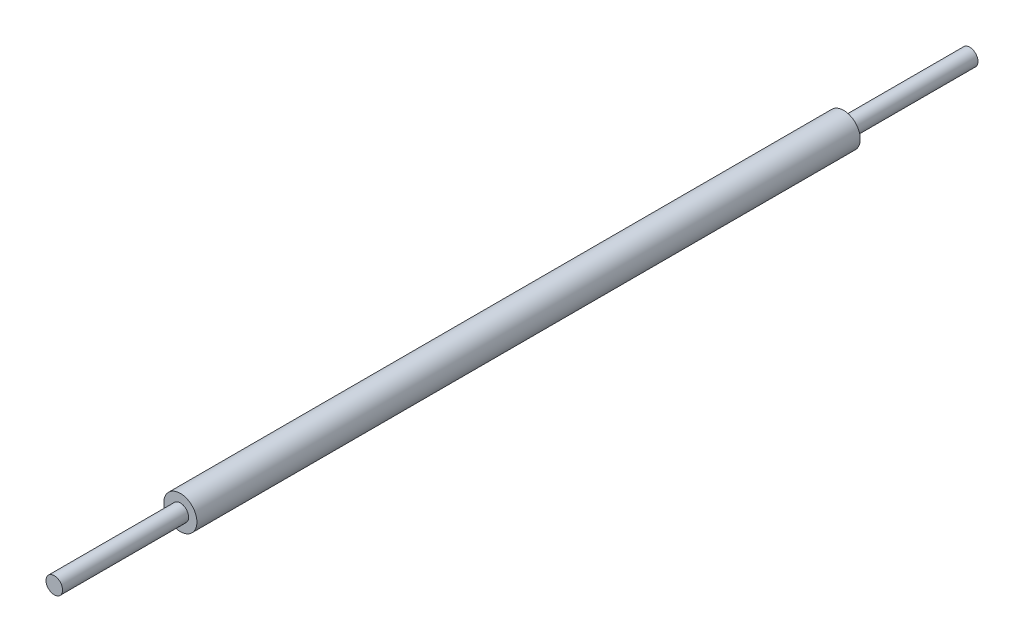
ISO-10303-21;
HEADER;
FILE_DESCRIPTION(('STEP AP214'),'2;1');
FILE_NAME('part.step','',(''),(''),'','','');
FILE_SCHEMA(('AUTOMOTIVE_DESIGN { 1 0 10303 214 1 1 1 1 }'));
ENDSEC;
DATA;
#1=APPLICATION_CONTEXT('core data for automotive mechanical design processes');
#2=APPLICATION_PROTOCOL_DEFINITION('international standard','automotive_design',2000,#1);
#3=PRODUCT_CONTEXT('',#1,'mechanical');
#4=PRODUCT('Part','Part','',(#3));
#5=PRODUCT_RELATED_PRODUCT_CATEGORY('part','',(#4));
#6=PRODUCT_DEFINITION_FORMATION('','',#4);
#7=PRODUCT_DEFINITION_CONTEXT('part definition',#1,'design');
#8=PRODUCT_DEFINITION('design','',#6,#7);
#9=PRODUCT_DEFINITION_SHAPE('','',#8);
#10=(LENGTH_UNIT() NAMED_UNIT(*) SI_UNIT(.MILLI.,.METRE.));
#11=(NAMED_UNIT(*) PLANE_ANGLE_UNIT() SI_UNIT($,.RADIAN.));
#12=(NAMED_UNIT(*) SI_UNIT($,.STERADIAN.) SOLID_ANGLE_UNIT());
#13=UNCERTAINTY_MEASURE_WITH_UNIT(LENGTH_MEASURE(1.E-05),#10,'distance_accuracy_value','');
#14=(GEOMETRIC_REPRESENTATION_CONTEXT(3) GLOBAL_UNCERTAINTY_ASSIGNED_CONTEXT((#13)) GLOBAL_UNIT_ASSIGNED_CONTEXT((#10,
#11,#12)) REPRESENTATION_CONTEXT('',''));
#15=CARTESIAN_POINT('',(0.,0.,0.));
#16=DIRECTION('',(0.,0.,1.));
#17=DIRECTION('',(1.,0.,0.));
#18=AXIS2_PLACEMENT_3D('',#15,#16,#17);
#19=CARTESIAN_POINT('',(0.,0.,96.52));
#20=DIRECTION('',(0.,0.,-1.));
#21=DIRECTION('',(-1.,0.,0.));
#22=AXIS2_PLACEMENT_3D('',#19,#20,#21);
#23=CYLINDRICAL_SURFACE('',#22,6.35);
#24=CARTESIAN_POINT('',(0.,0.,96.52));
#25=DIRECTION('',(0.,0.,1.));
#26=DIRECTION('',(1.,0.,0.));
#27=AXIS2_PLACEMENT_3D('',#24,#25,#26);
#28=CIRCLE('',#27,6.35);
#29=CARTESIAN_POINT('',(6.35,0.,96.52));
#30=VERTEX_POINT('',#29);
#31=EDGE_CURVE('E41',#30,#30,#28,.T.);
#32=ORIENTED_EDGE('',*,*,#31,.F.);
#33=EDGE_LOOP('',(#32));
#34=FACE_BOUND('',#33,.T.);
#35=CARTESIAN_POINT('',(0.,0.,0.));
#36=DIRECTION('',(0.,0.,1.));
#37=DIRECTION('',(1.,0.,0.));
#38=AXIS2_PLACEMENT_3D('',#35,#36,#37);
#39=CIRCLE('',#38,6.35);
#40=CARTESIAN_POINT('',(6.35,0.,0.));
#41=VERTEX_POINT('',#40);
#42=EDGE_CURVE('E37',#41,#41,#39,.T.);
#43=ORIENTED_EDGE('',*,*,#42,.T.);
#44=EDGE_LOOP('',(#43));
#45=FACE_BOUND('',#44,.T.);
#46=ADVANCED_FACE('F34',(#34,#45),#23,.T.);
#47=CARTESIAN_POINT('',(0.,0.,0.));
#48=DIRECTION('',(0.,0.,1.));
#49=DIRECTION('',(1.,0.,0.));
#50=AXIS2_PLACEMENT_3D('',#47,#48,#49);
#51=PLANE('',#50);
#52=ORIENTED_EDGE('',*,*,#42,.F.);
#53=EDGE_LOOP('',(#52));
#54=FACE_BOUND('',#53,.T.);
#55=ADVANCED_FACE('F75',(#54),#51,.F.);
#56=CARTESIAN_POINT('',(0.,0.,604.52));
#57=DIRECTION('',(0.,0.,-1.));
#58=DIRECTION('',(-1.,0.,0.));
#59=AXIS2_PLACEMENT_3D('',#56,#57,#58);
#60=CYLINDRICAL_SURFACE('',#59,12.7);
#61=CARTESIAN_POINT('',(0.,0.,604.52));
#62=DIRECTION('',(0.,0.,1.));
#63=DIRECTION('',(1.,0.,0.));
#64=AXIS2_PLACEMENT_3D('',#61,#62,#63);
#65=CIRCLE('',#64,12.7);
#66=CARTESIAN_POINT('',(12.7,0.,604.52));
#67=VERTEX_POINT('',#66);
#68=EDGE_CURVE('E49',#67,#67,#65,.T.);
#69=ORIENTED_EDGE('',*,*,#68,.F.);
#70=EDGE_LOOP('',(#69));
#71=FACE_BOUND('',#70,.T.);
#72=CARTESIAN_POINT('',(0.,0.,96.52));
#73=DIRECTION('',(0.,0.,1.));
#74=DIRECTION('',(1.,0.,0.));
#75=AXIS2_PLACEMENT_3D('',#72,#73,#74);
#76=CIRCLE('',#75,12.7);
#77=CARTESIAN_POINT('',(12.7,0.,96.52));
#78=VERTEX_POINT('',#77);
#79=EDGE_CURVE('E52',#78,#78,#76,.T.);
#80=ORIENTED_EDGE('',*,*,#79,.T.);
#81=EDGE_LOOP('',(#80));
#82=FACE_BOUND('',#81,.T.);
#83=ADVANCED_FACE('F80',(#71,#82),#60,.T.);
#84=CARTESIAN_POINT('',(0.,0.,604.52));
#85=DIRECTION('',(0.,0.,1.));
#86=DIRECTION('',(1.,0.,0.));
#87=AXIS2_PLACEMENT_3D('',#84,#85,#86);
#88=PLANE('',#87);
#89=CARTESIAN_POINT('',(0.,0.,604.52));
#90=DIRECTION('',(0.,0.,1.));
#91=DIRECTION('',(1.,0.,0.));
#92=AXIS2_PLACEMENT_3D('',#89,#90,#91);
#93=CIRCLE('',#92,6.35);
#94=CARTESIAN_POINT('',(6.35,0.,604.52));
#95=VERTEX_POINT('',#94);
#96=EDGE_CURVE('E10',#95,#95,#93,.T.);
#97=ORIENTED_EDGE('',*,*,#96,.F.);
#98=EDGE_LOOP('',(#97));
#99=FACE_BOUND('',#98,.T.);
#100=ORIENTED_EDGE('',*,*,#68,.T.);
#101=EDGE_LOOP('',(#100));
#102=FACE_BOUND('',#101,.T.);
#103=ADVANCED_FACE('F70',(#99,#102),#88,.T.);
#104=CARTESIAN_POINT('',(0.,0.,96.52));
#105=DIRECTION('',(0.,0.,1.));
#106=DIRECTION('',(1.,0.,0.));
#107=AXIS2_PLACEMENT_3D('',#104,#105,#106);
#108=PLANE('',#107);
#109=ORIENTED_EDGE('',*,*,#31,.T.);
#110=EDGE_LOOP('',(#109));
#111=FACE_BOUND('',#110,.T.);
#112=ORIENTED_EDGE('',*,*,#79,.F.);
#113=EDGE_LOOP('',(#112));
#114=FACE_BOUND('',#113,.T.);
#115=ADVANCED_FACE('F63',(#111,#114),#108,.F.);
#116=CARTESIAN_POINT('',(0.,0.,701.04));
#117=DIRECTION('',(0.,0.,-1.));
#118=DIRECTION('',(-1.,0.,0.));
#119=AXIS2_PLACEMENT_3D('',#116,#117,#118);
#120=CYLINDRICAL_SURFACE('',#119,6.35);
#121=CARTESIAN_POINT('',(0.,0.,701.04));
#122=DIRECTION('',(0.,0.,1.));
#123=DIRECTION('',(1.,0.,0.));
#124=AXIS2_PLACEMENT_3D('',#121,#122,#123);
#125=CIRCLE('',#124,6.35);
#126=CARTESIAN_POINT('',(6.35,0.,701.04));
#127=VERTEX_POINT('',#126);
#128=EDGE_CURVE('E48',#127,#127,#125,.T.);
#129=ORIENTED_EDGE('',*,*,#128,.F.);
#130=EDGE_LOOP('',(#129));
#131=FACE_BOUND('',#130,.T.);
#132=ORIENTED_EDGE('',*,*,#96,.T.);
#133=EDGE_LOOP('',(#132));
#134=FACE_BOUND('',#133,.T.);
#135=ADVANCED_FACE('F61',(#131,#134),#120,.T.);
#136=CARTESIAN_POINT('',(0.,0.,701.04));
#137=DIRECTION('',(0.,0.,1.));
#138=DIRECTION('',(1.,0.,0.));
#139=AXIS2_PLACEMENT_3D('',#136,#137,#138);
#140=PLANE('',#139);
#141=ORIENTED_EDGE('',*,*,#128,.T.);
#142=EDGE_LOOP('',(#141));
#143=FACE_BOUND('',#142,.T.);
#144=ADVANCED_FACE('F59',(#143),#140,.T.);
#145=CLOSED_SHELL('',(#46,#55,#83,#103,#115,#135,#144));
#146=MANIFOLD_SOLID_BREP('B2',#145);
#147=ADVANCED_BREP_SHAPE_REPRESENTATION('',(#18,#146),#14);
#148=SHAPE_DEFINITION_REPRESENTATION(#9,#147);
ENDSEC;
END-ISO-10303-21;
